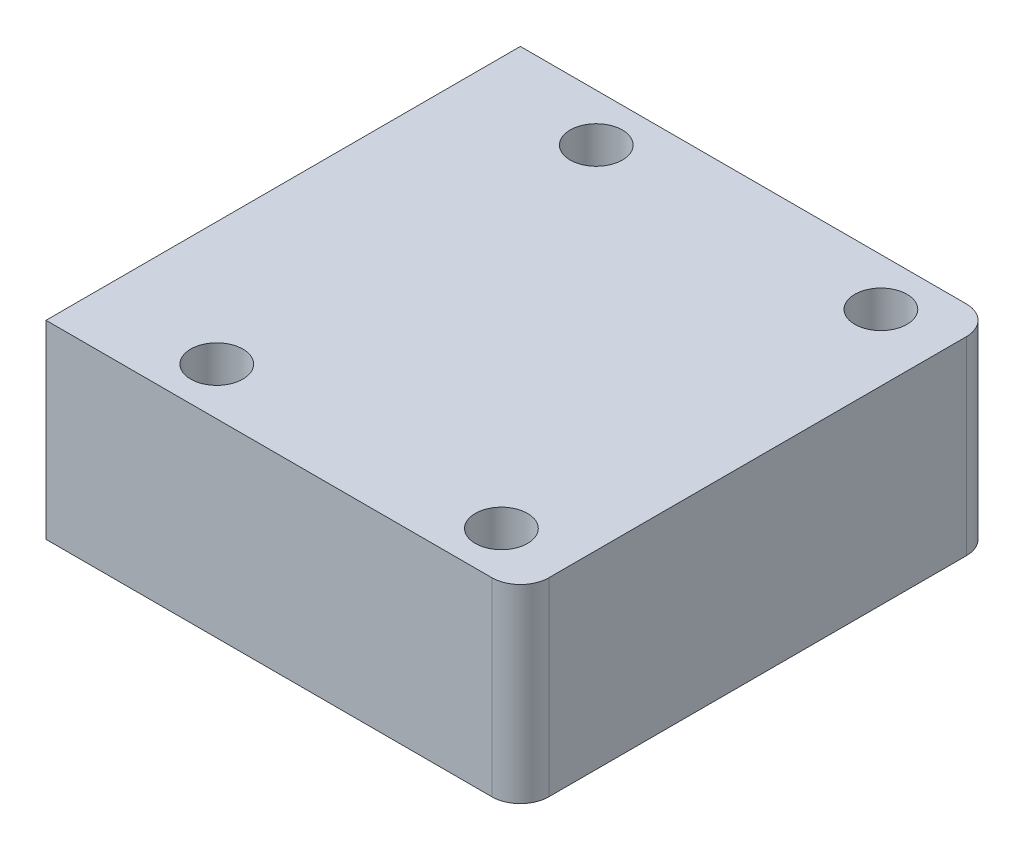
ISO-10303-21;
HEADER;
FILE_DESCRIPTION(('STEP AP214'),'2;1');
FILE_NAME('part.step','',(''),(''),'','','');
FILE_SCHEMA(('AUTOMOTIVE_DESIGN { 1 0 10303 214 1 1 1 1 }'));
ENDSEC;
DATA;
#1=APPLICATION_CONTEXT('core data for automotive mechanical design processes');
#2=APPLICATION_PROTOCOL_DEFINITION('international standard','automotive_design',2000,#1);
#3=PRODUCT_CONTEXT('',#1,'mechanical');
#4=PRODUCT('Part','Part','',(#3));
#5=PRODUCT_RELATED_PRODUCT_CATEGORY('part','',(#4));
#6=PRODUCT_DEFINITION_FORMATION('','',#4);
#7=PRODUCT_DEFINITION_CONTEXT('part definition',#1,'design');
#8=PRODUCT_DEFINITION('design','',#6,#7);
#9=PRODUCT_DEFINITION_SHAPE('','',#8);
#10=(LENGTH_UNIT() NAMED_UNIT(*) SI_UNIT(.MILLI.,.METRE.));
#11=(NAMED_UNIT(*) PLANE_ANGLE_UNIT() SI_UNIT($,.RADIAN.));
#12=(NAMED_UNIT(*) SI_UNIT($,.STERADIAN.) SOLID_ANGLE_UNIT());
#13=UNCERTAINTY_MEASURE_WITH_UNIT(LENGTH_MEASURE(1.E-05),#10,'distance_accuracy_value','');
#14=(GEOMETRIC_REPRESENTATION_CONTEXT(3) GLOBAL_UNCERTAINTY_ASSIGNED_CONTEXT((#13)) GLOBAL_UNIT_ASSIGNED_CONTEXT((#10,
#11,#12)) REPRESENTATION_CONTEXT('',''));
#15=CARTESIAN_POINT('',(0.,0.,0.));
#16=DIRECTION('',(0.,0.,1.));
#17=DIRECTION('',(1.,0.,0.));
#18=AXIS2_PLACEMENT_3D('',#15,#16,#17);
#19=CARTESIAN_POINT('',(0.,20.,0.));
#20=DIRECTION('',(0.,-1.,0.));
#21=DIRECTION('',(0.,0.,-1.));
#22=AXIS2_PLACEMENT_3D('',#19,#20,#21);
#23=PLANE('',#22);
#24=DIRECTION('',(0.,0.,-1.));
#25=VECTOR('',#24,1.);
#26=CARTESIAN_POINT('',(22.,20.,25.));
#27=LINE('',#26,#25);
#28=CARTESIAN_POINT('',(22.,20.,22.));
#29=VERTEX_POINT('',#28);
#30=CARTESIAN_POINT('',(22.,20.,-22.));
#31=VERTEX_POINT('',#30);
#32=EDGE_CURVE('E103',#29,#31,#27,.T.);
#33=ORIENTED_EDGE('',*,*,#32,.T.);
#34=CARTESIAN_POINT('',(19.,20.,-22.));
#35=DIRECTION('',(0.,-1.,0.));
#36=DIRECTION('',(0.,0.,-1.));
#37=AXIS2_PLACEMENT_3D('',#34,#35,#36);
#38=CIRCLE('',#37,3.);
#39=CARTESIAN_POINT('',(19.,20.,-25.));
#40=VERTEX_POINT('',#39);
#41=EDGE_CURVE('E47',#31,#40,#38,.F.);
#42=ORIENTED_EDGE('',*,*,#41,.T.);
#43=DIRECTION('',(-1.,0.,0.));
#44=VECTOR('',#43,1.);
#45=CARTESIAN_POINT('',(-28.,20.,-25.));
#46=LINE('',#45,#44);
#47=CARTESIAN_POINT('',(-28.,20.,-25.));
#48=VERTEX_POINT('',#47);
#49=EDGE_CURVE('E93',#40,#48,#46,.T.);
#50=ORIENTED_EDGE('',*,*,#49,.T.);
#51=DIRECTION('',(0.,0.,1.));
#52=VECTOR('',#51,1.);
#53=CARTESIAN_POINT('',(-28.,20.,25.));
#54=LINE('',#53,#52);
#55=CARTESIAN_POINT('',(-28.,20.,25.));
#56=VERTEX_POINT('',#55);
#57=EDGE_CURVE('E97',#48,#56,#54,.T.);
#58=ORIENTED_EDGE('',*,*,#57,.T.);
#59=DIRECTION('',(1.,0.,0.));
#60=VECTOR('',#59,1.);
#61=CARTESIAN_POINT('',(-28.,20.,25.));
#62=LINE('',#61,#60);
#63=CARTESIAN_POINT('',(19.,20.,25.));
#64=VERTEX_POINT('',#63);
#65=EDGE_CURVE('E117',#56,#64,#62,.T.);
#66=ORIENTED_EDGE('',*,*,#65,.T.);
#67=CARTESIAN_POINT('',(19.,20.,22.));
#68=DIRECTION('',(0.,-1.,0.));
#69=DIRECTION('',(0.,0.,-1.));
#70=AXIS2_PLACEMENT_3D('',#67,#68,#69);
#71=CIRCLE('',#70,3.);
#72=EDGE_CURVE('E140',#64,#29,#71,.F.);
#73=ORIENTED_EDGE('',*,*,#72,.T.);
#74=EDGE_LOOP('',(#33,#42,#50,#58,#66,#73));
#75=FACE_BOUND('',#74,.T.);
#76=CARTESIAN_POINT('',(-15.,20.,-20.));
#77=DIRECTION('',(0.,1.,0.));
#78=DIRECTION('',(0.,0.,1.));
#79=AXIS2_PLACEMENT_3D('',#76,#77,#78);
#80=CIRCLE('',#79,2.75);
#81=CARTESIAN_POINT('',(-15.,20.,-17.25));
#82=VERTEX_POINT('',#81);
#83=EDGE_CURVE('E124',#82,#82,#80,.T.);
#84=ORIENTED_EDGE('',*,*,#83,.F.);
#85=EDGE_LOOP('',(#84));
#86=FACE_BOUND('',#85,.T.);
#87=CARTESIAN_POINT('',(15.,20.,-20.));
#88=DIRECTION('',(0.,1.,0.));
#89=DIRECTION('',(0.,0.,1.));
#90=AXIS2_PLACEMENT_3D('',#87,#88,#89);
#91=CIRCLE('',#90,2.75);
#92=CARTESIAN_POINT('',(15.,20.,-17.25));
#93=VERTEX_POINT('',#92);
#94=EDGE_CURVE('E243',#93,#93,#91,.T.);
#95=ORIENTED_EDGE('',*,*,#94,.F.);
#96=EDGE_LOOP('',(#95));
#97=FACE_BOUND('',#96,.T.);
#98=CARTESIAN_POINT('',(-15.,20.,20.));
#99=DIRECTION('',(0.,1.,0.));
#100=DIRECTION('',(0.,0.,1.));
#101=AXIS2_PLACEMENT_3D('',#98,#99,#100);
#102=CIRCLE('',#101,2.75);
#103=CARTESIAN_POINT('',(-15.,20.,22.75));
#104=VERTEX_POINT('',#103);
#105=EDGE_CURVE('E237',#104,#104,#102,.T.);
#106=ORIENTED_EDGE('',*,*,#105,.F.);
#107=EDGE_LOOP('',(#106));
#108=FACE_BOUND('',#107,.T.);
#109=CARTESIAN_POINT('',(15.,20.,20.));
#110=DIRECTION('',(0.,1.,0.));
#111=DIRECTION('',(0.,0.,1.));
#112=AXIS2_PLACEMENT_3D('',#109,#110,#111);
#113=CIRCLE('',#112,2.75);
#114=CARTESIAN_POINT('',(15.,20.,22.75));
#115=VERTEX_POINT('',#114);
#116=EDGE_CURVE('E217',#115,#115,#113,.T.);
#117=ORIENTED_EDGE('',*,*,#116,.F.);
#118=EDGE_LOOP('',(#117));
#119=FACE_BOUND('',#118,.T.);
#120=ADVANCED_FACE('F39',(#75,#86,#97,#108,#119),#23,.F.);
#121=CARTESIAN_POINT('',(0.,0.,0.));
#122=DIRECTION('',(0.,-1.,0.));
#123=DIRECTION('',(0.,0.,-1.));
#124=AXIS2_PLACEMENT_3D('',#121,#122,#123);
#125=PLANE('',#124);
#126=CARTESIAN_POINT('',(-15.,0.,20.));
#127=DIRECTION('',(0.,1.,0.));
#128=DIRECTION('',(0.,0.,1.));
#129=AXIS2_PLACEMENT_3D('',#126,#127,#128);
#130=CIRCLE('',#129,2.75);
#131=CARTESIAN_POINT('',(-15.,0.,22.75));
#132=VERTEX_POINT('',#131);
#133=EDGE_CURVE('E235',#132,#132,#130,.T.);
#134=ORIENTED_EDGE('',*,*,#133,.T.);
#135=EDGE_LOOP('',(#134));
#136=FACE_BOUND('',#135,.T.);
#137=CARTESIAN_POINT('',(-15.,0.,-20.));
#138=DIRECTION('',(0.,1.,0.));
#139=DIRECTION('',(0.,0.,1.));
#140=AXIS2_PLACEMENT_3D('',#137,#138,#139);
#141=CIRCLE('',#140,2.75);
#142=CARTESIAN_POINT('',(-15.,0.,-17.25));
#143=VERTEX_POINT('',#142);
#144=EDGE_CURVE('E246',#143,#143,#141,.T.);
#145=ORIENTED_EDGE('',*,*,#144,.T.);
#146=EDGE_LOOP('',(#145));
#147=FACE_BOUND('',#146,.T.);
#148=DIRECTION('',(-1.,0.,0.));
#149=VECTOR('',#148,1.);
#150=CARTESIAN_POINT('',(-28.,0.,-25.));
#151=LINE('',#150,#149);
#152=CARTESIAN_POINT('',(19.,0.,-25.));
#153=VERTEX_POINT('',#152);
#154=CARTESIAN_POINT('',(-28.,0.,-25.));
#155=VERTEX_POINT('',#154);
#156=EDGE_CURVE('E109',#153,#155,#151,.T.);
#157=ORIENTED_EDGE('',*,*,#156,.F.);
#158=CARTESIAN_POINT('',(19.,0.,-22.));
#159=DIRECTION('',(0.,-1.,0.));
#160=DIRECTION('',(0.,0.,-1.));
#161=AXIS2_PLACEMENT_3D('',#158,#159,#160);
#162=CIRCLE('',#161,3.);
#163=CARTESIAN_POINT('',(22.,0.,-22.));
#164=VERTEX_POINT('',#163);
#165=EDGE_CURVE('E134',#153,#164,#162,.T.);
#166=ORIENTED_EDGE('',*,*,#165,.T.);
#167=DIRECTION('',(0.,0.,-1.));
#168=VECTOR('',#167,1.);
#169=CARTESIAN_POINT('',(22.,0.,25.));
#170=LINE('',#169,#168);
#171=CARTESIAN_POINT('',(22.,0.,22.));
#172=VERTEX_POINT('',#171);
#173=EDGE_CURVE('E122',#172,#164,#170,.T.);
#174=ORIENTED_EDGE('',*,*,#173,.F.);
#175=CARTESIAN_POINT('',(19.,0.,22.));
#176=DIRECTION('',(0.,-1.,0.));
#177=DIRECTION('',(0.,0.,-1.));
#178=AXIS2_PLACEMENT_3D('',#175,#176,#177);
#179=CIRCLE('',#178,3.);
#180=CARTESIAN_POINT('',(19.,0.,25.));
#181=VERTEX_POINT('',#180);
#182=EDGE_CURVE('E132',#172,#181,#179,.T.);
#183=ORIENTED_EDGE('',*,*,#182,.T.);
#184=DIRECTION('',(1.,0.,0.));
#185=VECTOR('',#184,1.);
#186=CARTESIAN_POINT('',(-28.,0.,25.));
#187=LINE('',#186,#185);
#188=CARTESIAN_POINT('',(-28.,0.,25.));
#189=VERTEX_POINT('',#188);
#190=EDGE_CURVE('E128',#189,#181,#187,.T.);
#191=ORIENTED_EDGE('',*,*,#190,.F.);
#192=DIRECTION('',(0.,0.,1.));
#193=VECTOR('',#192,1.);
#194=CARTESIAN_POINT('',(-28.,0.,25.));
#195=LINE('',#194,#193);
#196=EDGE_CURVE('E126',#155,#189,#195,.T.);
#197=ORIENTED_EDGE('',*,*,#196,.F.);
#198=EDGE_LOOP('',(#157,#166,#174,#183,#191,#197));
#199=FACE_BOUND('',#198,.T.);
#200=CARTESIAN_POINT('',(15.,0.,-20.));
#201=DIRECTION('',(0.,1.,0.));
#202=DIRECTION('',(0.,0.,1.));
#203=AXIS2_PLACEMENT_3D('',#200,#201,#202);
#204=CIRCLE('',#203,2.75);
#205=CARTESIAN_POINT('',(15.,0.,-17.25));
#206=VERTEX_POINT('',#205);
#207=EDGE_CURVE('E240',#206,#206,#204,.T.);
#208=ORIENTED_EDGE('',*,*,#207,.T.);
#209=EDGE_LOOP('',(#208));
#210=FACE_BOUND('',#209,.T.);
#211=CARTESIAN_POINT('',(15.,0.,20.));
#212=DIRECTION('',(0.,1.,0.));
#213=DIRECTION('',(0.,0.,1.));
#214=AXIS2_PLACEMENT_3D('',#211,#212,#213);
#215=CIRCLE('',#214,2.75);
#216=CARTESIAN_POINT('',(15.,0.,22.75));
#217=VERTEX_POINT('',#216);
#218=EDGE_CURVE('E213',#217,#217,#215,.T.);
#219=ORIENTED_EDGE('',*,*,#218,.T.);
#220=EDGE_LOOP('',(#219));
#221=FACE_BOUND('',#220,.T.);
#222=ADVANCED_FACE('F148',(#136,#147,#199,#210,#221),#125,.T.);
#223=CARTESIAN_POINT('',(22.,20.,25.));
#224=DIRECTION('',(-1.,0.,0.));
#225=DIRECTION('',(0.,0.,1.));
#226=AXIS2_PLACEMENT_3D('',#223,#224,#225);
#227=PLANE('',#226);
#228=ORIENTED_EDGE('',*,*,#173,.T.);
#229=DIRECTION('',(0.,-1.,0.));
#230=VECTOR('',#229,1.);
#231=CARTESIAN_POINT('',(22.,20.,-22.));
#232=LINE('',#231,#230);
#233=EDGE_CURVE('E60',#164,#31,#232,.F.);
#234=ORIENTED_EDGE('',*,*,#233,.T.);
#235=ORIENTED_EDGE('',*,*,#32,.F.);
#236=DIRECTION('',(0.,-1.,0.));
#237=VECTOR('',#236,1.);
#238=CARTESIAN_POINT('',(22.,20.,22.));
#239=LINE('',#238,#237);
#240=EDGE_CURVE('E136',#29,#172,#239,.T.);
#241=ORIENTED_EDGE('',*,*,#240,.T.);
#242=EDGE_LOOP('',(#228,#234,#235,#241));
#243=FACE_BOUND('',#242,.T.);
#244=ADVANCED_FACE('F144',(#243),#227,.F.);
#245=CARTESIAN_POINT('',(-28.,20.,-25.));
#246=DIRECTION('',(0.,0.,1.));
#247=DIRECTION('',(1.,0.,0.));
#248=AXIS2_PLACEMENT_3D('',#245,#246,#247);
#249=PLANE('',#248);
#250=ORIENTED_EDGE('',*,*,#49,.F.);
#251=DIRECTION('',(0.,-1.,0.));
#252=VECTOR('',#251,1.);
#253=CARTESIAN_POINT('',(19.,20.,-25.));
#254=LINE('',#253,#252);
#255=EDGE_CURVE('E112',#40,#153,#254,.T.);
#256=ORIENTED_EDGE('',*,*,#255,.T.);
#257=ORIENTED_EDGE('',*,*,#156,.T.);
#258=DIRECTION('',(0.,-1.,0.));
#259=VECTOR('',#258,1.);
#260=CARTESIAN_POINT('',(-28.,20.,-25.));
#261=LINE('',#260,#259);
#262=EDGE_CURVE('E106',#48,#155,#261,.T.);
#263=ORIENTED_EDGE('',*,*,#262,.F.);
#264=EDGE_LOOP('',(#250,#256,#257,#263));
#265=FACE_BOUND('',#264,.T.);
#266=ADVANCED_FACE('F107',(#265),#249,.F.);
#267=CARTESIAN_POINT('',(-28.,20.,25.));
#268=DIRECTION('',(1.,0.,0.));
#269=DIRECTION('',(0.,0.,-1.));
#270=AXIS2_PLACEMENT_3D('',#267,#268,#269);
#271=PLANE('',#270);
#272=CARTESIAN_POINT('',(-28.,14.,-19.));
#273=DIRECTION('',(-1.,0.,0.));
#274=DIRECTION('',(0.,0.,1.));
#275=AXIS2_PLACEMENT_3D('',#272,#273,#274);
#276=CIRCLE('',#275,1.4);
#277=CARTESIAN_POINT('',(-28.,14.,-17.6));
#278=VERTEX_POINT('',#277);
#279=EDGE_CURVE('E214',#278,#278,#276,.T.);
#280=ORIENTED_EDGE('',*,*,#279,.F.);
#281=EDGE_LOOP('',(#280));
#282=FACE_BOUND('',#281,.T.);
#283=CARTESIAN_POINT('',(-28.,4.,0.));
#284=DIRECTION('',(-1.,0.,0.));
#285=DIRECTION('',(0.,0.,1.));
#286=AXIS2_PLACEMENT_3D('',#283,#284,#285);
#287=CIRCLE('',#286,1.4);
#288=CARTESIAN_POINT('',(-28.,4.,1.4));
#289=VERTEX_POINT('',#288);
#290=EDGE_CURVE('E220',#289,#289,#287,.T.);
#291=ORIENTED_EDGE('',*,*,#290,.F.);
#292=EDGE_LOOP('',(#291));
#293=FACE_BOUND('',#292,.T.);
#294=CARTESIAN_POINT('',(-28.,14.,19.));
#295=DIRECTION('',(-1.,0.,0.));
#296=DIRECTION('',(0.,0.,1.));
#297=AXIS2_PLACEMENT_3D('',#294,#295,#296);
#298=CIRCLE('',#297,1.4);
#299=CARTESIAN_POINT('',(-28.,14.,20.4));
#300=VERTEX_POINT('',#299);
#301=EDGE_CURVE('E228',#300,#300,#298,.T.);
#302=ORIENTED_EDGE('',*,*,#301,.F.);
#303=EDGE_LOOP('',(#302));
#304=FACE_BOUND('',#303,.T.);
#305=ORIENTED_EDGE('',*,*,#196,.T.);
#306=DIRECTION('',(0.,-1.,0.));
#307=VECTOR('',#306,1.);
#308=CARTESIAN_POINT('',(-28.,20.,25.));
#309=LINE('',#308,#307);
#310=EDGE_CURVE('E113',#56,#189,#309,.T.);
#311=ORIENTED_EDGE('',*,*,#310,.F.);
#312=ORIENTED_EDGE('',*,*,#57,.F.);
#313=ORIENTED_EDGE('',*,*,#262,.T.);
#314=EDGE_LOOP('',(#305,#311,#312,#313));
#315=FACE_BOUND('',#314,.T.);
#316=ADVANCED_FACE('F115',(#282,#293,#304,#315),#271,.F.);
#317=CARTESIAN_POINT('',(-28.,20.,25.));
#318=DIRECTION('',(0.,0.,-1.));
#319=DIRECTION('',(-1.,0.,0.));
#320=AXIS2_PLACEMENT_3D('',#317,#318,#319);
#321=PLANE('',#320);
#322=ORIENTED_EDGE('',*,*,#190,.T.);
#323=DIRECTION('',(0.,-1.,0.));
#324=VECTOR('',#323,1.);
#325=CARTESIAN_POINT('',(19.,20.,25.));
#326=LINE('',#325,#324);
#327=EDGE_CURVE('E11',#181,#64,#326,.F.);
#328=ORIENTED_EDGE('',*,*,#327,.T.);
#329=ORIENTED_EDGE('',*,*,#65,.F.);
#330=ORIENTED_EDGE('',*,*,#310,.T.);
#331=EDGE_LOOP('',(#322,#328,#329,#330));
#332=FACE_BOUND('',#331,.T.);
#333=ADVANCED_FACE('F150',(#332),#321,.F.);
#334=CARTESIAN_POINT('',(-15.,20.,-20.));
#335=DIRECTION('',(0.,-1.,0.));
#336=DIRECTION('',(0.,0.,-1.));
#337=AXIS2_PLACEMENT_3D('',#334,#335,#336);
#338=CYLINDRICAL_SURFACE('',#337,2.75);
#339=ORIENTED_EDGE('',*,*,#83,.T.);
#340=EDGE_LOOP('',(#339));
#341=FACE_BOUND('',#340,.T.);
#342=ORIENTED_EDGE('',*,*,#144,.F.);
#343=EDGE_LOOP('',(#342));
#344=FACE_BOUND('',#343,.T.);
#345=ADVANCED_FACE('F152',(#341,#344),#338,.F.);
#346=CARTESIAN_POINT('',(15.,20.,-20.));
#347=DIRECTION('',(0.,-1.,0.));
#348=DIRECTION('',(0.,0.,-1.));
#349=AXIS2_PLACEMENT_3D('',#346,#347,#348);
#350=CYLINDRICAL_SURFACE('',#349,2.75);
#351=ORIENTED_EDGE('',*,*,#94,.T.);
#352=EDGE_LOOP('',(#351));
#353=FACE_BOUND('',#352,.T.);
#354=ORIENTED_EDGE('',*,*,#207,.F.);
#355=EDGE_LOOP('',(#354));
#356=FACE_BOUND('',#355,.T.);
#357=ADVANCED_FACE('F159',(#353,#356),#350,.F.);
#358=CARTESIAN_POINT('',(-15.,20.,20.));
#359=DIRECTION('',(0.,-1.,0.));
#360=DIRECTION('',(0.,0.,-1.));
#361=AXIS2_PLACEMENT_3D('',#358,#359,#360);
#362=CYLINDRICAL_SURFACE('',#361,2.75);
#363=ORIENTED_EDGE('',*,*,#105,.T.);
#364=EDGE_LOOP('',(#363));
#365=FACE_BOUND('',#364,.T.);
#366=ORIENTED_EDGE('',*,*,#133,.F.);
#367=EDGE_LOOP('',(#366));
#368=FACE_BOUND('',#367,.T.);
#369=ADVANCED_FACE('F176',(#365,#368),#362,.F.);
#370=CARTESIAN_POINT('',(15.,20.,20.));
#371=DIRECTION('',(0.,-1.,0.));
#372=DIRECTION('',(0.,0.,-1.));
#373=AXIS2_PLACEMENT_3D('',#370,#371,#372);
#374=CYLINDRICAL_SURFACE('',#373,2.75);
#375=ORIENTED_EDGE('',*,*,#116,.T.);
#376=EDGE_LOOP('',(#375));
#377=FACE_BOUND('',#376,.T.);
#378=ORIENTED_EDGE('',*,*,#218,.F.);
#379=EDGE_LOOP('',(#378));
#380=FACE_BOUND('',#379,.T.);
#381=ADVANCED_FACE('F180',(#377,#380),#374,.F.);
#382=CARTESIAN_POINT('',(19.,20.,-22.));
#383=DIRECTION('',(0.,-1.,0.));
#384=DIRECTION('',(0.,0.,-1.));
#385=AXIS2_PLACEMENT_3D('',#382,#383,#384);
#386=CYLINDRICAL_SURFACE('',#385,3.);
#387=ORIENTED_EDGE('',*,*,#41,.F.);
#388=ORIENTED_EDGE('',*,*,#233,.F.);
#389=ORIENTED_EDGE('',*,*,#165,.F.);
#390=ORIENTED_EDGE('',*,*,#255,.F.);
#391=EDGE_LOOP('',(#387,#388,#389,#390));
#392=FACE_BOUND('',#391,.T.);
#393=ADVANCED_FACE('F183',(#392),#386,.T.);
#394=CARTESIAN_POINT('',(19.,20.,22.));
#395=DIRECTION('',(0.,-1.,0.));
#396=DIRECTION('',(0.,0.,-1.));
#397=AXIS2_PLACEMENT_3D('',#394,#395,#396);
#398=CYLINDRICAL_SURFACE('',#397,3.);
#399=ORIENTED_EDGE('',*,*,#72,.F.);
#400=ORIENTED_EDGE('',*,*,#327,.F.);
#401=ORIENTED_EDGE('',*,*,#182,.F.);
#402=ORIENTED_EDGE('',*,*,#240,.F.);
#403=EDGE_LOOP('',(#399,#400,#401,#402));
#404=FACE_BOUND('',#403,.T.);
#405=ADVANCED_FACE('F41',(#404),#398,.T.);
#406=CARTESIAN_POINT('',(-20.,14.,19.));
#407=DIRECTION('',(-1.,0.,0.));
#408=DIRECTION('',(0.,0.,1.));
#409=AXIS2_PLACEMENT_3D('',#406,#407,#408);
#410=CYLINDRICAL_SURFACE('',#409,1.4);
#411=CARTESIAN_POINT('',(-20.,14.,19.));
#412=DIRECTION('',(-1.,0.,0.));
#413=DIRECTION('',(0.,0.,1.));
#414=AXIS2_PLACEMENT_3D('',#411,#412,#413);
#415=CIRCLE('',#414,1.4);
#416=CARTESIAN_POINT('',(-20.,14.,20.4));
#417=VERTEX_POINT('',#416);
#418=EDGE_CURVE('E231',#417,#417,#415,.T.);
#419=ORIENTED_EDGE('',*,*,#418,.F.);
#420=EDGE_LOOP('',(#419));
#421=FACE_BOUND('',#420,.T.);
#422=ORIENTED_EDGE('',*,*,#301,.T.);
#423=EDGE_LOOP('',(#422));
#424=FACE_BOUND('',#423,.T.);
#425=ADVANCED_FACE('F189',(#421,#424),#410,.F.);
#426=CARTESIAN_POINT('',(-20.,14.,19.));
#427=DIRECTION('',(-1.,0.,0.));
#428=DIRECTION('',(0.,0.,1.));
#429=AXIS2_PLACEMENT_3D('',#426,#427,#428);
#430=PLANE('',#429);
#431=ORIENTED_EDGE('',*,*,#418,.T.);
#432=EDGE_LOOP('',(#431));
#433=FACE_BOUND('',#432,.T.);
#434=ADVANCED_FACE('F185',(#433),#430,.T.);
#435=CARTESIAN_POINT('',(-20.,4.,0.));
#436=DIRECTION('',(-1.,0.,0.));
#437=DIRECTION('',(0.,0.,1.));
#438=AXIS2_PLACEMENT_3D('',#435,#436,#437);
#439=CYLINDRICAL_SURFACE('',#438,1.4);
#440=CARTESIAN_POINT('',(-20.,4.,0.));
#441=DIRECTION('',(-1.,0.,0.));
#442=DIRECTION('',(0.,0.,1.));
#443=AXIS2_PLACEMENT_3D('',#440,#441,#442);
#444=CIRCLE('',#443,1.4);
#445=CARTESIAN_POINT('',(-20.,4.,1.4));
#446=VERTEX_POINT('',#445);
#447=EDGE_CURVE('E225',#446,#446,#444,.T.);
#448=ORIENTED_EDGE('',*,*,#447,.F.);
#449=EDGE_LOOP('',(#448));
#450=FACE_BOUND('',#449,.T.);
#451=ORIENTED_EDGE('',*,*,#290,.T.);
#452=EDGE_LOOP('',(#451));
#453=FACE_BOUND('',#452,.T.);
#454=ADVANCED_FACE('F188',(#450,#453),#439,.F.);
#455=CARTESIAN_POINT('',(-20.,4.,0.));
#456=DIRECTION('',(-1.,0.,0.));
#457=DIRECTION('',(0.,0.,1.));
#458=AXIS2_PLACEMENT_3D('',#455,#456,#457);
#459=PLANE('',#458);
#460=ORIENTED_EDGE('',*,*,#447,.T.);
#461=EDGE_LOOP('',(#460));
#462=FACE_BOUND('',#461,.T.);
#463=ADVANCED_FACE('F194',(#462),#459,.T.);
#464=CARTESIAN_POINT('',(-20.,14.,-19.));
#465=DIRECTION('',(-1.,0.,0.));
#466=DIRECTION('',(0.,0.,1.));
#467=AXIS2_PLACEMENT_3D('',#464,#465,#466);
#468=CYLINDRICAL_SURFACE('',#467,1.4);
#469=CARTESIAN_POINT('',(-20.,14.,-19.));
#470=DIRECTION('',(-1.,0.,0.));
#471=DIRECTION('',(0.,0.,1.));
#472=AXIS2_PLACEMENT_3D('',#469,#470,#471);
#473=CIRCLE('',#472,1.4);
#474=CARTESIAN_POINT('',(-20.,14.,-17.6));
#475=VERTEX_POINT('',#474);
#476=EDGE_CURVE('E212',#475,#475,#473,.T.);
#477=ORIENTED_EDGE('',*,*,#476,.F.);
#478=EDGE_LOOP('',(#477));
#479=FACE_BOUND('',#478,.T.);
#480=ORIENTED_EDGE('',*,*,#279,.T.);
#481=EDGE_LOOP('',(#480));
#482=FACE_BOUND('',#481,.T.);
#483=ADVANCED_FACE('F197',(#479,#482),#468,.F.);
#484=CARTESIAN_POINT('',(-20.,14.,-19.));
#485=DIRECTION('',(-1.,0.,0.));
#486=DIRECTION('',(0.,0.,1.));
#487=AXIS2_PLACEMENT_3D('',#484,#485,#486);
#488=PLANE('',#487);
#489=ORIENTED_EDGE('',*,*,#476,.T.);
#490=EDGE_LOOP('',(#489));
#491=FACE_BOUND('',#490,.T.);
#492=ADVANCED_FACE('F204',(#491),#488,.T.);
#493=CLOSED_SHELL('',(#120,#222,#244,#266,#316,#333,#345,#357,#369,#381,#393,#405,#425,#434,
#454,#463,#483,#492));
#494=MANIFOLD_SOLID_BREP('B2',#493);
#495=ADVANCED_BREP_SHAPE_REPRESENTATION('',(#18,#494),#14);
#496=SHAPE_DEFINITION_REPRESENTATION(#9,#495);
ENDSEC;
END-ISO-10303-21;
